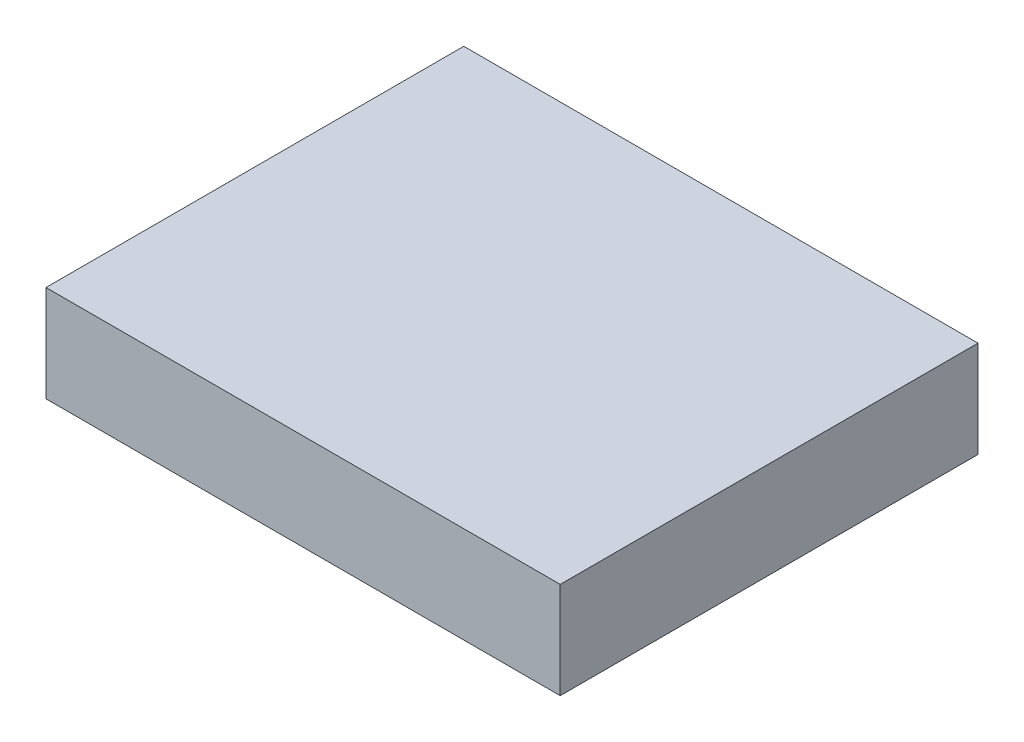
ISO-10303-21;
HEADER;
FILE_DESCRIPTION(('STEP AP214'),'2;1');
FILE_NAME('part.step','',(''),(''),'','','');
FILE_SCHEMA(('AUTOMOTIVE_DESIGN { 1 0 10303 214 1 1 1 1 }'));
ENDSEC;
DATA;
#1=APPLICATION_CONTEXT('core data for automotive mechanical design processes');
#2=APPLICATION_PROTOCOL_DEFINITION('international standard','automotive_design',2000,#1);
#3=PRODUCT_CONTEXT('',#1,'mechanical');
#4=PRODUCT('Part','Part','',(#3));
#5=PRODUCT_RELATED_PRODUCT_CATEGORY('part','',(#4));
#6=PRODUCT_DEFINITION_FORMATION('','',#4);
#7=PRODUCT_DEFINITION_CONTEXT('part definition',#1,'design');
#8=PRODUCT_DEFINITION('design','',#6,#7);
#9=PRODUCT_DEFINITION_SHAPE('','',#8);
#10=(LENGTH_UNIT() NAMED_UNIT(*) SI_UNIT(.MILLI.,.METRE.));
#11=(NAMED_UNIT(*) PLANE_ANGLE_UNIT() SI_UNIT($,.RADIAN.));
#12=(NAMED_UNIT(*) SI_UNIT($,.STERADIAN.) SOLID_ANGLE_UNIT());
#13=UNCERTAINTY_MEASURE_WITH_UNIT(LENGTH_MEASURE(1.E-05),#10,'distance_accuracy_value','');
#14=(GEOMETRIC_REPRESENTATION_CONTEXT(3) GLOBAL_UNCERTAINTY_ASSIGNED_CONTEXT((#13)) GLOBAL_UNIT_ASSIGNED_CONTEXT((#10,
#11,#12)) REPRESENTATION_CONTEXT('',''));
#15=CARTESIAN_POINT('',(0.,0.,0.));
#16=DIRECTION('',(0.,0.,1.));
#17=DIRECTION('',(1.,0.,0.));
#18=AXIS2_PLACEMENT_3D('',#15,#16,#17);
#19=CARTESIAN_POINT('',(-80.,30.,-65.));
#20=DIRECTION('',(1.,0.,0.));
#21=DIRECTION('',(0.,0.,-1.));
#22=AXIS2_PLACEMENT_3D('',#19,#20,#21);
#23=PLANE('',#22);
#24=DIRECTION('',(0.,0.,1.));
#25=VECTOR('',#24,1.);
#26=CARTESIAN_POINT('',(-80.,0.,-65.));
#27=LINE('',#26,#25);
#28=CARTESIAN_POINT('',(-80.,0.,-65.));
#29=VERTEX_POINT('',#28);
#30=CARTESIAN_POINT('',(-80.,0.,65.));
#31=VERTEX_POINT('',#30);
#32=EDGE_CURVE('E98',#29,#31,#27,.T.);
#33=ORIENTED_EDGE('',*,*,#32,.T.);
#34=DIRECTION('',(0.,-1.,0.));
#35=VECTOR('',#34,1.);
#36=CARTESIAN_POINT('',(-80.,30.,65.));
#37=LINE('',#36,#35);
#38=CARTESIAN_POINT('',(-80.,30.,65.));
#39=VERTEX_POINT('',#38);
#40=EDGE_CURVE('E11',#39,#31,#37,.T.);
#41=ORIENTED_EDGE('',*,*,#40,.F.);
#42=DIRECTION('',(0.,0.,1.));
#43=VECTOR('',#42,1.);
#44=CARTESIAN_POINT('',(-80.,30.,-65.));
#45=LINE('',#44,#43);
#46=CARTESIAN_POINT('',(-80.,30.,-65.));
#47=VERTEX_POINT('',#46);
#48=EDGE_CURVE('E86',#47,#39,#45,.T.);
#49=ORIENTED_EDGE('',*,*,#48,.F.);
#50=DIRECTION('',(0.,-1.,0.));
#51=VECTOR('',#50,1.);
#52=CARTESIAN_POINT('',(-80.,30.,-65.));
#53=LINE('',#52,#51);
#54=EDGE_CURVE('E94',#47,#29,#53,.T.);
#55=ORIENTED_EDGE('',*,*,#54,.T.);
#56=EDGE_LOOP('',(#33,#41,#49,#55));
#57=FACE_BOUND('',#56,.T.);
#58=ADVANCED_FACE('F35',(#57),#23,.F.);
#59=CARTESIAN_POINT('',(-80.,30.,65.));
#60=DIRECTION('',(0.,0.,-1.));
#61=DIRECTION('',(-1.,0.,0.));
#62=AXIS2_PLACEMENT_3D('',#59,#60,#61);
#63=PLANE('',#62);
#64=DIRECTION('',(1.,0.,0.));
#65=VECTOR('',#64,1.);
#66=CARTESIAN_POINT('',(-80.,0.,65.));
#67=LINE('',#66,#65);
#68=CARTESIAN_POINT('',(80.,0.,65.));
#69=VERTEX_POINT('',#68);
#70=EDGE_CURVE('E90',#31,#69,#67,.T.);
#71=ORIENTED_EDGE('',*,*,#70,.T.);
#72=DIRECTION('',(0.,-1.,0.));
#73=VECTOR('',#72,1.);
#74=CARTESIAN_POINT('',(80.,30.,65.));
#75=LINE('',#74,#73);
#76=CARTESIAN_POINT('',(80.,30.,65.));
#77=VERTEX_POINT('',#76);
#78=EDGE_CURVE('E43',#77,#69,#75,.T.);
#79=ORIENTED_EDGE('',*,*,#78,.F.);
#80=DIRECTION('',(1.,0.,0.));
#81=VECTOR('',#80,1.);
#82=CARTESIAN_POINT('',(-80.,30.,65.));
#83=LINE('',#82,#81);
#84=EDGE_CURVE('E81',#39,#77,#83,.T.);
#85=ORIENTED_EDGE('',*,*,#84,.F.);
#86=ORIENTED_EDGE('',*,*,#40,.T.);
#87=EDGE_LOOP('',(#71,#79,#85,#86));
#88=FACE_BOUND('',#87,.T.);
#89=ADVANCED_FACE('F89',(#88),#63,.F.);
#90=CARTESIAN_POINT('',(80.,30.,-65.));
#91=DIRECTION('',(-1.,0.,0.));
#92=DIRECTION('',(0.,0.,1.));
#93=AXIS2_PLACEMENT_3D('',#90,#91,#92);
#94=PLANE('',#93);
#95=DIRECTION('',(0.,0.,-1.));
#96=VECTOR('',#95,1.);
#97=CARTESIAN_POINT('',(80.,0.,-65.));
#98=LINE('',#97,#96);
#99=CARTESIAN_POINT('',(80.,0.,-65.));
#100=VERTEX_POINT('',#99);
#101=EDGE_CURVE('E68',#69,#100,#98,.T.);
#102=ORIENTED_EDGE('',*,*,#101,.T.);
#103=DIRECTION('',(0.,-1.,0.));
#104=VECTOR('',#103,1.);
#105=CARTESIAN_POINT('',(80.,30.,-65.));
#106=LINE('',#105,#104);
#107=CARTESIAN_POINT('',(80.,30.,-65.));
#108=VERTEX_POINT('',#107);
#109=EDGE_CURVE('E91',#108,#100,#106,.T.);
#110=ORIENTED_EDGE('',*,*,#109,.F.);
#111=DIRECTION('',(0.,0.,-1.));
#112=VECTOR('',#111,1.);
#113=CARTESIAN_POINT('',(80.,30.,-65.));
#114=LINE('',#113,#112);
#115=EDGE_CURVE('E84',#77,#108,#114,.T.);
#116=ORIENTED_EDGE('',*,*,#115,.F.);
#117=ORIENTED_EDGE('',*,*,#78,.T.);
#118=EDGE_LOOP('',(#102,#110,#116,#117));
#119=FACE_BOUND('',#118,.T.);
#120=ADVANCED_FACE('F92',(#119),#94,.F.);
#121=CARTESIAN_POINT('',(-80.,30.,-65.));
#122=DIRECTION('',(0.,0.,1.));
#123=DIRECTION('',(1.,0.,0.));
#124=AXIS2_PLACEMENT_3D('',#121,#122,#123);
#125=PLANE('',#124);
#126=DIRECTION('',(-1.,0.,0.));
#127=VECTOR('',#126,1.);
#128=CARTESIAN_POINT('',(-80.,0.,-65.));
#129=LINE('',#128,#127);
#130=EDGE_CURVE('E74',#100,#29,#129,.T.);
#131=ORIENTED_EDGE('',*,*,#130,.T.);
#132=ORIENTED_EDGE('',*,*,#54,.F.);
#133=DIRECTION('',(-1.,0.,0.));
#134=VECTOR('',#133,1.);
#135=CARTESIAN_POINT('',(-80.,30.,-65.));
#136=LINE('',#135,#134);
#137=EDGE_CURVE('E51',#108,#47,#136,.T.);
#138=ORIENTED_EDGE('',*,*,#137,.F.);
#139=ORIENTED_EDGE('',*,*,#109,.T.);
#140=EDGE_LOOP('',(#131,#132,#138,#139));
#141=FACE_BOUND('',#140,.T.);
#142=ADVANCED_FACE('F105',(#141),#125,.F.);
#143=CARTESIAN_POINT('',(0.,30.,0.));
#144=DIRECTION('',(0.,1.,0.));
#145=DIRECTION('',(0.,0.,1.));
#146=AXIS2_PLACEMENT_3D('',#143,#144,#145);
#147=PLANE('',#146);
#148=ORIENTED_EDGE('',*,*,#48,.T.);
#149=ORIENTED_EDGE('',*,*,#84,.T.);
#150=ORIENTED_EDGE('',*,*,#115,.T.);
#151=ORIENTED_EDGE('',*,*,#137,.T.);
#152=EDGE_LOOP('',(#148,#149,#150,#151));
#153=FACE_BOUND('',#152,.T.);
#154=ADVANCED_FACE('F82',(#153),#147,.T.);
#155=CARTESIAN_POINT('',(0.,0.,0.));
#156=DIRECTION('',(0.,1.,0.));
#157=DIRECTION('',(0.,0.,1.));
#158=AXIS2_PLACEMENT_3D('',#155,#156,#157);
#159=PLANE('',#158);
#160=ORIENTED_EDGE('',*,*,#32,.F.);
#161=ORIENTED_EDGE('',*,*,#130,.F.);
#162=ORIENTED_EDGE('',*,*,#101,.F.);
#163=ORIENTED_EDGE('',*,*,#70,.F.);
#164=EDGE_LOOP('',(#160,#161,#162,#163));
#165=FACE_BOUND('',#164,.T.);
#166=ADVANCED_FACE('F108',(#165),#159,.F.);
#167=CLOSED_SHELL('',(#58,#89,#120,#142,#154,#166));
#168=MANIFOLD_SOLID_BREP('B2',#167);
#169=ADVANCED_BREP_SHAPE_REPRESENTATION('',(#18,#168),#14);
#170=SHAPE_DEFINITION_REPRESENTATION(#9,#169);
ENDSEC;
END-ISO-10303-21;
